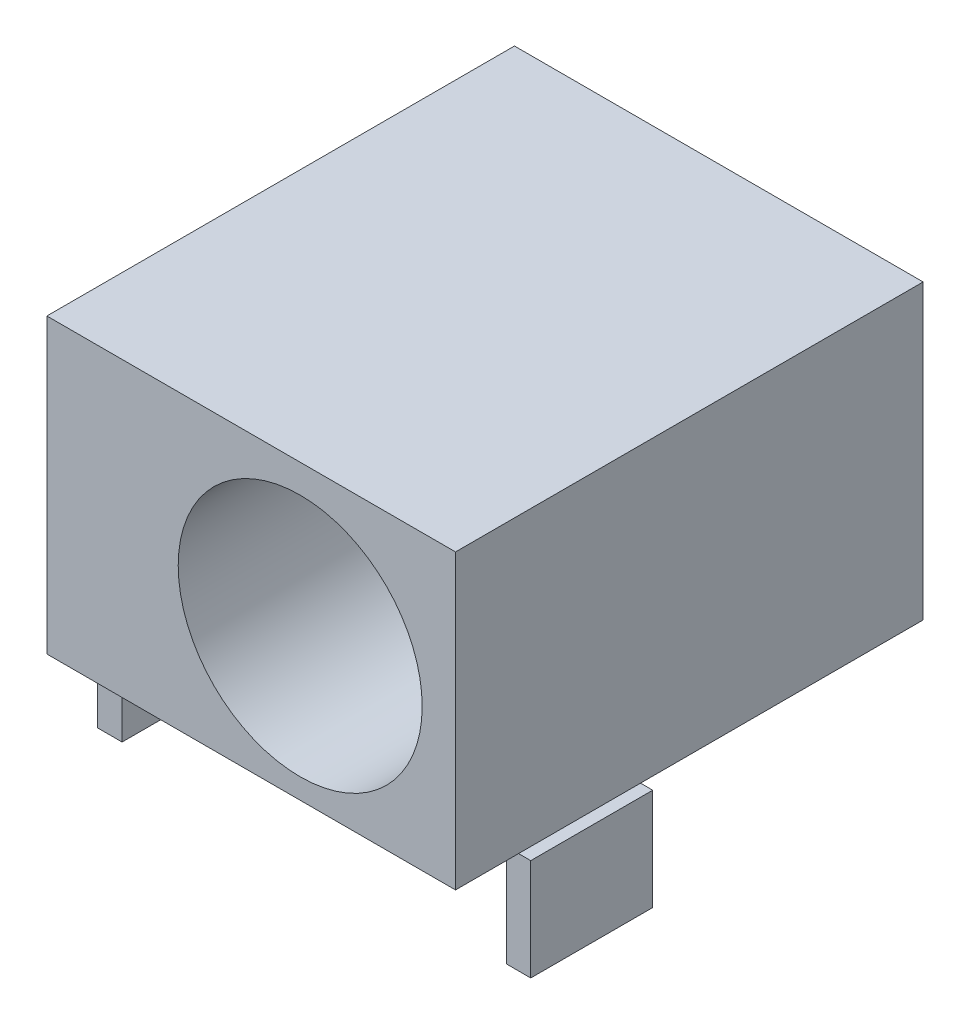
ISO-10303-21;
HEADER;
FILE_DESCRIPTION(('STEP AP214'),'2;1');
FILE_NAME('part.step','',(''),(''),'','','');
FILE_SCHEMA(('AUTOMOTIVE_DESIGN { 1 0 10303 214 1 1 1 1 }'));
ENDSEC;
DATA;
#1=APPLICATION_CONTEXT('core data for automotive mechanical design processes');
#2=APPLICATION_PROTOCOL_DEFINITION('international standard','automotive_design',2000,#1);
#3=PRODUCT_CONTEXT('',#1,'mechanical');
#4=PRODUCT('Part','Part','',(#3));
#5=PRODUCT_RELATED_PRODUCT_CATEGORY('part','',(#4));
#6=PRODUCT_DEFINITION_FORMATION('','',#4);
#7=PRODUCT_DEFINITION_CONTEXT('part definition',#1,'design');
#8=PRODUCT_DEFINITION('design','',#6,#7);
#9=PRODUCT_DEFINITION_SHAPE('','',#8);
#10=(LENGTH_UNIT() NAMED_UNIT(*) SI_UNIT(.MILLI.,.METRE.));
#11=(NAMED_UNIT(*) PLANE_ANGLE_UNIT() SI_UNIT($,.RADIAN.));
#12=(NAMED_UNIT(*) SI_UNIT($,.STERADIAN.) SOLID_ANGLE_UNIT());
#13=UNCERTAINTY_MEASURE_WITH_UNIT(LENGTH_MEASURE(1.E-05),#10,'distance_accuracy_value','');
#14=(GEOMETRIC_REPRESENTATION_CONTEXT(3) GLOBAL_UNCERTAINTY_ASSIGNED_CONTEXT((#13)) GLOBAL_UNIT_ASSIGNED_CONTEXT((#10,
#11,#12)) REPRESENTATION_CONTEXT('',''));
#15=CARTESIAN_POINT('',(0.,0.,0.));
#16=DIRECTION('',(0.,0.,1.));
#17=DIRECTION('',(1.,0.,0.));
#18=AXIS2_PLACEMENT_3D('',#15,#16,#17);
#19=CARTESIAN_POINT('',(0.,0.,0.));
#20=DIRECTION('',(0.,1.,0.));
#21=DIRECTION('',(0.,0.,1.));
#22=AXIS2_PLACEMENT_3D('',#19,#20,#21);
#23=PLANE('',#22);
#24=DIRECTION('',(1.,0.,0.));
#25=VECTOR('',#24,1.);
#26=CARTESIAN_POINT('',(0.,0.,1.2));
#27=LINE('',#26,#25);
#28=CARTESIAN_POINT('',(4.725,0.,1.2));
#29=VERTEX_POINT('',#28);
#30=CARTESIAN_POINT('',(5.025,0.,1.2));
#31=VERTEX_POINT('',#30);
#32=EDGE_CURVE('E161',#29,#31,#27,.T.);
#33=ORIENTED_EDGE('',*,*,#32,.F.);
#34=DIRECTION('',(0.,0.,1.));
#35=VECTOR('',#34,1.);
#36=CARTESIAN_POINT('',(4.725,0.,0.));
#37=LINE('',#36,#35);
#38=CARTESIAN_POINT('',(4.725,0.,4.2));
#39=VERTEX_POINT('',#38);
#40=EDGE_CURVE('E172',#29,#39,#37,.T.);
#41=ORIENTED_EDGE('',*,*,#40,.T.);
#42=DIRECTION('',(1.,0.,0.));
#43=VECTOR('',#42,1.);
#44=CARTESIAN_POINT('',(0.,0.,4.19999999999999));
#45=LINE('',#44,#43);
#46=CARTESIAN_POINT('',(5.025,0.,4.2));
#47=VERTEX_POINT('',#46);
#48=EDGE_CURVE('E142',#39,#47,#45,.T.);
#49=ORIENTED_EDGE('',*,*,#48,.T.);
#50=DIRECTION('',(0.,0.,1.));
#51=VECTOR('',#50,1.);
#52=CARTESIAN_POINT('',(5.025,0.,0.));
#53=LINE('',#52,#51);
#54=CARTESIAN_POINT('',(5.025,0.,5.75));
#55=VERTEX_POINT('',#54);
#56=EDGE_CURVE('E202',#47,#55,#53,.T.);
#57=ORIENTED_EDGE('',*,*,#56,.T.);
#58=DIRECTION('',(1.,0.,0.));
#59=VECTOR('',#58,1.);
#60=CARTESIAN_POINT('',(0.,0.,5.75));
#61=LINE('',#60,#59);
#62=CARTESIAN_POINT('',(-5.025,0.,5.75));
#63=VERTEX_POINT('',#62);
#64=EDGE_CURVE('E199',#63,#55,#61,.T.);
#65=ORIENTED_EDGE('',*,*,#64,.F.);
#66=DIRECTION('',(0.,0.,1.));
#67=VECTOR('',#66,1.);
#68=CARTESIAN_POINT('',(-5.025,0.,0.));
#69=LINE('',#68,#67);
#70=CARTESIAN_POINT('',(-5.025,0.,4.2));
#71=VERTEX_POINT('',#70);
#72=EDGE_CURVE('E46',#71,#63,#69,.T.);
#73=ORIENTED_EDGE('',*,*,#72,.F.);
#74=DIRECTION('',(-1.,0.,0.));
#75=VECTOR('',#74,1.);
#76=CARTESIAN_POINT('',(0.,0.,4.19999999999999));
#77=LINE('',#76,#75);
#78=CARTESIAN_POINT('',(-4.725,0.,4.2));
#79=VERTEX_POINT('',#78);
#80=EDGE_CURVE('E227',#79,#71,#77,.T.);
#81=ORIENTED_EDGE('',*,*,#80,.F.);
#82=DIRECTION('',(0.,0.,1.));
#83=VECTOR('',#82,1.);
#84=CARTESIAN_POINT('',(-4.725,0.,0.));
#85=LINE('',#84,#83);
#86=CARTESIAN_POINT('',(-4.725,0.,1.2));
#87=VERTEX_POINT('',#86);
#88=EDGE_CURVE('E229',#87,#79,#85,.T.);
#89=ORIENTED_EDGE('',*,*,#88,.F.);
#90=DIRECTION('',(-1.,0.,0.));
#91=VECTOR('',#90,1.);
#92=CARTESIAN_POINT('',(0.,0.,1.2));
#93=LINE('',#92,#91);
#94=CARTESIAN_POINT('',(-5.025,0.,1.2));
#95=VERTEX_POINT('',#94);
#96=EDGE_CURVE('E232',#87,#95,#93,.T.);
#97=ORIENTED_EDGE('',*,*,#96,.T.);
#98=CARTESIAN_POINT('',(-5.025,0.,-5.75));
#99=VERTEX_POINT('',#98);
#100=EDGE_CURVE('E45',#99,#95,#69,.T.);
#101=ORIENTED_EDGE('',*,*,#100,.F.);
#102=DIRECTION('',(1.,0.,0.));
#103=VECTOR('',#102,1.);
#104=CARTESIAN_POINT('',(0.,0.,-5.75));
#105=LINE('',#104,#103);
#106=CARTESIAN_POINT('',(5.025,0.,-5.75));
#107=VERTEX_POINT('',#106);
#108=EDGE_CURVE('E179',#99,#107,#105,.T.);
#109=ORIENTED_EDGE('',*,*,#108,.T.);
#110=EDGE_CURVE('E188',#107,#31,#53,.T.);
#111=ORIENTED_EDGE('',*,*,#110,.T.);
#112=EDGE_LOOP('',(#33,#41,#49,#57,#65,#73,#81,#89,#97,#101,#109,#111));
#113=FACE_BOUND('',#112,.T.);
#114=ADVANCED_FACE('F34',(#113),#23,.F.);
#115=CARTESIAN_POINT('',(0.,-2.5,4.19999999999999));
#116=DIRECTION('',(0.,0.,-1.));
#117=DIRECTION('',(-1.,0.,0.));
#118=AXIS2_PLACEMENT_3D('',#115,#116,#117);
#119=PLANE('',#118);
#120=ORIENTED_EDGE('',*,*,#80,.T.);
#121=CARTESIAN_POINT('',(-5.325,0.,4.2));
#122=VERTEX_POINT('',#121);
#123=EDGE_CURVE('E215',#71,#122,#77,.T.);
#124=ORIENTED_EDGE('',*,*,#123,.T.);
#125=DIRECTION('',(0.,1.,0.));
#126=VECTOR('',#125,1.);
#127=CARTESIAN_POINT('',(-5.325,-2.5,4.2));
#128=LINE('',#127,#126);
#129=CARTESIAN_POINT('',(-5.325,-2.5,4.2));
#130=VERTEX_POINT('',#129);
#131=EDGE_CURVE('E43',#130,#122,#128,.T.);
#132=ORIENTED_EDGE('',*,*,#131,.F.);
#133=DIRECTION('',(-1.,0.,0.));
#134=VECTOR('',#133,1.);
#135=CARTESIAN_POINT('',(0.,-2.5,4.19999999999999));
#136=LINE('',#135,#134);
#137=CARTESIAN_POINT('',(-4.725,-2.5,4.2));
#138=VERTEX_POINT('',#137);
#139=EDGE_CURVE('E216',#138,#130,#136,.T.);
#140=ORIENTED_EDGE('',*,*,#139,.F.);
#141=DIRECTION('',(0.,1.,0.));
#142=VECTOR('',#141,1.);
#143=CARTESIAN_POINT('',(-4.725,-2.5,4.2));
#144=LINE('',#143,#142);
#145=EDGE_CURVE('E38',#138,#79,#144,.T.);
#146=ORIENTED_EDGE('',*,*,#145,.T.);
#147=EDGE_LOOP('',(#120,#124,#132,#140,#146));
#148=FACE_BOUND('',#147,.T.);
#149=ADVANCED_FACE('F36',(#148),#119,.F.);
#150=CARTESIAN_POINT('',(-5.325,-2.5,0.));
#151=DIRECTION('',(-1.,0.,0.));
#152=DIRECTION('',(0.,0.,1.));
#153=AXIS2_PLACEMENT_3D('',#150,#151,#152);
#154=PLANE('',#153);
#155=DIRECTION('',(0.,0.,1.));
#156=VECTOR('',#155,1.);
#157=CARTESIAN_POINT('',(-5.325,0.,0.));
#158=LINE('',#157,#156);
#159=CARTESIAN_POINT('',(-5.325,0.,1.2));
#160=VERTEX_POINT('',#159);
#161=EDGE_CURVE('E219',#160,#122,#158,.T.);
#162=ORIENTED_EDGE('',*,*,#161,.F.);
#163=DIRECTION('',(0.,1.,0.));
#164=VECTOR('',#163,1.);
#165=CARTESIAN_POINT('',(-5.325,-2.5,1.2));
#166=LINE('',#165,#164);
#167=CARTESIAN_POINT('',(-5.325,-2.5,1.2));
#168=VERTEX_POINT('',#167);
#169=EDGE_CURVE('E239',#168,#160,#166,.T.);
#170=ORIENTED_EDGE('',*,*,#169,.F.);
#171=DIRECTION('',(0.,0.,1.));
#172=VECTOR('',#171,1.);
#173=CARTESIAN_POINT('',(-5.325,-2.5,0.));
#174=LINE('',#173,#172);
#175=EDGE_CURVE('E224',#168,#130,#174,.T.);
#176=ORIENTED_EDGE('',*,*,#175,.T.);
#177=ORIENTED_EDGE('',*,*,#131,.T.);
#178=EDGE_LOOP('',(#162,#170,#176,#177));
#179=FACE_BOUND('',#178,.T.);
#180=ADVANCED_FACE('F298',(#179),#154,.T.);
#181=CARTESIAN_POINT('',(0.,-2.5,1.2));
#182=DIRECTION('',(0.,0.,-1.));
#183=DIRECTION('',(-1.,0.,0.));
#184=AXIS2_PLACEMENT_3D('',#181,#182,#183);
#185=PLANE('',#184);
#186=ORIENTED_EDGE('',*,*,#96,.F.);
#187=DIRECTION('',(0.,1.,0.));
#188=VECTOR('',#187,1.);
#189=CARTESIAN_POINT('',(-4.725,-2.5,1.2));
#190=LINE('',#189,#188);
#191=CARTESIAN_POINT('',(-4.725,-2.5,1.2));
#192=VERTEX_POINT('',#191);
#193=EDGE_CURVE('E241',#192,#87,#190,.T.);
#194=ORIENTED_EDGE('',*,*,#193,.F.);
#195=DIRECTION('',(-1.,0.,0.));
#196=VECTOR('',#195,1.);
#197=CARTESIAN_POINT('',(0.,-2.5,1.2));
#198=LINE('',#197,#196);
#199=EDGE_CURVE('E221',#192,#168,#198,.T.);
#200=ORIENTED_EDGE('',*,*,#199,.T.);
#201=ORIENTED_EDGE('',*,*,#169,.T.);
#202=EDGE_CURVE('E231',#95,#160,#93,.T.);
#203=ORIENTED_EDGE('',*,*,#202,.F.);
#204=EDGE_LOOP('',(#186,#194,#200,#201,#203));
#205=FACE_BOUND('',#204,.T.);
#206=ADVANCED_FACE('F317',(#205),#185,.T.);
#207=CARTESIAN_POINT('',(-4.725,-2.5,0.));
#208=DIRECTION('',(-1.,0.,0.));
#209=DIRECTION('',(0.,0.,1.));
#210=AXIS2_PLACEMENT_3D('',#207,#208,#209);
#211=PLANE('',#210);
#212=ORIENTED_EDGE('',*,*,#88,.T.);
#213=ORIENTED_EDGE('',*,*,#145,.F.);
#214=DIRECTION('',(0.,0.,1.));
#215=VECTOR('',#214,1.);
#216=CARTESIAN_POINT('',(-4.725,-2.5,0.));
#217=LINE('',#216,#215);
#218=EDGE_CURVE('E218',#192,#138,#217,.T.);
#219=ORIENTED_EDGE('',*,*,#218,.F.);
#220=ORIENTED_EDGE('',*,*,#193,.T.);
#221=EDGE_LOOP('',(#212,#213,#219,#220));
#222=FACE_BOUND('',#221,.T.);
#223=ADVANCED_FACE('F311',(#222),#211,.F.);
#224=CARTESIAN_POINT('',(0.,-2.5,0.));
#225=DIRECTION('',(0.,1.,0.));
#226=DIRECTION('',(0.,0.,1.));
#227=AXIS2_PLACEMENT_3D('',#224,#225,#226);
#228=PLANE('',#227);
#229=ORIENTED_EDGE('',*,*,#139,.T.);
#230=ORIENTED_EDGE('',*,*,#175,.F.);
#231=ORIENTED_EDGE('',*,*,#199,.F.);
#232=ORIENTED_EDGE('',*,*,#218,.T.);
#233=EDGE_LOOP('',(#229,#230,#231,#232));
#234=FACE_BOUND('',#233,.T.);
#235=ADVANCED_FACE('F308',(#234),#228,.F.);
#236=CARTESIAN_POINT('',(0.,0.,0.));
#237=DIRECTION('',(0.,1.,0.));
#238=DIRECTION('',(0.,0.,1.));
#239=AXIS2_PLACEMENT_3D('',#236,#237,#238);
#240=PLANE('',#239);
#241=EDGE_CURVE('E12',#95,#71,#69,.T.);
#242=ORIENTED_EDGE('',*,*,#241,.F.);
#243=ORIENTED_EDGE('',*,*,#202,.T.);
#244=ORIENTED_EDGE('',*,*,#161,.T.);
#245=ORIENTED_EDGE('',*,*,#123,.F.);
#246=EDGE_LOOP('',(#242,#243,#244,#245));
#247=FACE_BOUND('',#246,.T.);
#248=ADVANCED_FACE('F307',(#247),#240,.T.);
#249=CARTESIAN_POINT('',(0.,7.2,-5.75));
#250=DIRECTION('',(0.,0.,-1.));
#251=DIRECTION('',(-1.,0.,0.));
#252=AXIS2_PLACEMENT_3D('',#249,#250,#251);
#253=PLANE('',#252);
#254=ORIENTED_EDGE('',*,*,#108,.F.);
#255=DIRECTION('',(0.,-1.,0.));
#256=VECTOR('',#255,1.);
#257=CARTESIAN_POINT('',(-5.025,7.2,-5.75));
#258=LINE('',#257,#256);
#259=CARTESIAN_POINT('',(-5.025,7.2,-5.75));
#260=VERTEX_POINT('',#259);
#261=EDGE_CURVE('E213',#260,#99,#258,.T.);
#262=ORIENTED_EDGE('',*,*,#261,.F.);
#263=DIRECTION('',(1.,0.,0.));
#264=VECTOR('',#263,1.);
#265=CARTESIAN_POINT('',(0.,7.2,-5.75));
#266=LINE('',#265,#264);
#267=CARTESIAN_POINT('',(5.025,7.2,-5.75));
#268=VERTEX_POINT('',#267);
#269=EDGE_CURVE('E184',#260,#268,#266,.T.);
#270=ORIENTED_EDGE('',*,*,#269,.T.);
#271=DIRECTION('',(0.,-1.,0.));
#272=VECTOR('',#271,1.);
#273=CARTESIAN_POINT('',(5.025,7.2,-5.75));
#274=LINE('',#273,#272);
#275=EDGE_CURVE('E195',#268,#107,#274,.T.);
#276=ORIENTED_EDGE('',*,*,#275,.T.);
#277=EDGE_LOOP('',(#254,#262,#270,#276));
#278=FACE_BOUND('',#277,.T.);
#279=ADVANCED_FACE('F264',(#278),#253,.T.);
#280=CARTESIAN_POINT('',(-5.025,7.2,0.));
#281=DIRECTION('',(1.,0.,0.));
#282=DIRECTION('',(0.,0.,-1.));
#283=AXIS2_PLACEMENT_3D('',#280,#281,#282);
#284=PLANE('',#283);
#285=ORIENTED_EDGE('',*,*,#100,.T.);
#286=ORIENTED_EDGE('',*,*,#241,.T.);
#287=ORIENTED_EDGE('',*,*,#72,.T.);
#288=DIRECTION('',(0.,-1.,0.));
#289=VECTOR('',#288,1.);
#290=CARTESIAN_POINT('',(-5.025,7.2,5.75));
#291=LINE('',#290,#289);
#292=CARTESIAN_POINT('',(-5.025,7.2,5.75));
#293=VERTEX_POINT('',#292);
#294=EDGE_CURVE('E210',#293,#63,#291,.T.);
#295=ORIENTED_EDGE('',*,*,#294,.F.);
#296=DIRECTION('',(0.,0.,1.));
#297=VECTOR('',#296,1.);
#298=CARTESIAN_POINT('',(-5.025,7.2,0.));
#299=LINE('',#298,#297);
#300=EDGE_CURVE('E187',#260,#293,#299,.T.);
#301=ORIENTED_EDGE('',*,*,#300,.F.);
#302=ORIENTED_EDGE('',*,*,#261,.T.);
#303=EDGE_LOOP('',(#285,#286,#287,#295,#301,#302));
#304=FACE_BOUND('',#303,.T.);
#305=ADVANCED_FACE('F258',(#304),#284,.F.);
#306=CARTESIAN_POINT('',(0.,7.2,5.75));
#307=DIRECTION('',(0.,0.,-1.));
#308=DIRECTION('',(-1.,0.,0.));
#309=AXIS2_PLACEMENT_3D('',#306,#307,#308);
#310=PLANE('',#309);
#311=CARTESIAN_POINT('',(1.205,3.5,5.75));
#312=DIRECTION('',(0.,0.,1.));
#313=DIRECTION('',(1.,0.,0.));
#314=AXIS2_PLACEMENT_3D('',#311,#312,#313);
#315=CIRCLE('',#314,3.);
#316=CARTESIAN_POINT('',(4.205,3.5,5.75));
#317=VERTEX_POINT('',#316);
#318=EDGE_CURVE('E432',#317,#317,#315,.T.);
#319=ORIENTED_EDGE('',*,*,#318,.F.);
#320=EDGE_LOOP('',(#319));
#321=FACE_BOUND('',#320,.T.);
#322=ORIENTED_EDGE('',*,*,#64,.T.);
#323=DIRECTION('',(0.,-1.,0.));
#324=VECTOR('',#323,1.);
#325=CARTESIAN_POINT('',(5.025,7.2,5.75));
#326=LINE('',#325,#324);
#327=CARTESIAN_POINT('',(5.025,7.2,5.75));
#328=VERTEX_POINT('',#327);
#329=EDGE_CURVE('E207',#328,#55,#326,.T.);
#330=ORIENTED_EDGE('',*,*,#329,.F.);
#331=DIRECTION('',(1.,0.,0.));
#332=VECTOR('',#331,1.);
#333=CARTESIAN_POINT('',(0.,7.2,5.75));
#334=LINE('',#333,#332);
#335=EDGE_CURVE('E190',#293,#328,#334,.T.);
#336=ORIENTED_EDGE('',*,*,#335,.F.);
#337=ORIENTED_EDGE('',*,*,#294,.T.);
#338=EDGE_LOOP('',(#322,#330,#336,#337));
#339=FACE_BOUND('',#338,.T.);
#340=ADVANCED_FACE('F282',(#321,#339),#310,.F.);
#341=CARTESIAN_POINT('',(5.025,7.2,0.));
#342=DIRECTION('',(1.,0.,0.));
#343=DIRECTION('',(0.,0.,-1.));
#344=AXIS2_PLACEMENT_3D('',#341,#342,#343);
#345=PLANE('',#344);
#346=ORIENTED_EDGE('',*,*,#110,.F.);
#347=ORIENTED_EDGE('',*,*,#275,.F.);
#348=DIRECTION('',(0.,0.,1.));
#349=VECTOR('',#348,1.);
#350=CARTESIAN_POINT('',(5.025,7.2,0.));
#351=LINE('',#350,#349);
#352=EDGE_CURVE('E192',#268,#328,#351,.T.);
#353=ORIENTED_EDGE('',*,*,#352,.T.);
#354=ORIENTED_EDGE('',*,*,#329,.T.);
#355=ORIENTED_EDGE('',*,*,#56,.F.);
#356=EDGE_CURVE('E205',#31,#47,#53,.T.);
#357=ORIENTED_EDGE('',*,*,#356,.F.);
#358=EDGE_LOOP('',(#346,#347,#353,#354,#355,#357));
#359=FACE_BOUND('',#358,.T.);
#360=ADVANCED_FACE('F268',(#359),#345,.T.);
#361=CARTESIAN_POINT('',(0.,7.2,0.));
#362=DIRECTION('',(0.,1.,0.));
#363=DIRECTION('',(0.,0.,1.));
#364=AXIS2_PLACEMENT_3D('',#361,#362,#363);
#365=PLANE('',#364);
#366=ORIENTED_EDGE('',*,*,#269,.F.);
#367=ORIENTED_EDGE('',*,*,#300,.T.);
#368=ORIENTED_EDGE('',*,*,#335,.T.);
#369=ORIENTED_EDGE('',*,*,#352,.F.);
#370=EDGE_LOOP('',(#366,#367,#368,#369));
#371=FACE_BOUND('',#370,.T.);
#372=ADVANCED_FACE('F284',(#371),#365,.T.);
#373=CARTESIAN_POINT('',(4.725,-2.5,0.));
#374=DIRECTION('',(-1.,0.,0.));
#375=DIRECTION('',(0.,0.,1.));
#376=AXIS2_PLACEMENT_3D('',#373,#374,#375);
#377=PLANE('',#376);
#378=ORIENTED_EDGE('',*,*,#40,.F.);
#379=DIRECTION('',(0.,1.,0.));
#380=VECTOR('',#379,1.);
#381=CARTESIAN_POINT('',(4.725,-2.5,1.2));
#382=LINE('',#381,#380);
#383=CARTESIAN_POINT('',(4.725,-2.5,1.2));
#384=VERTEX_POINT('',#383);
#385=EDGE_CURVE('E159',#384,#29,#382,.T.);
#386=ORIENTED_EDGE('',*,*,#385,.F.);
#387=DIRECTION('',(0.,0.,1.));
#388=VECTOR('',#387,1.);
#389=CARTESIAN_POINT('',(4.725,-2.5,0.));
#390=LINE('',#389,#388);
#391=CARTESIAN_POINT('',(4.725,-2.5,4.2));
#392=VERTEX_POINT('',#391);
#393=EDGE_CURVE('E153',#384,#392,#390,.T.);
#394=ORIENTED_EDGE('',*,*,#393,.T.);
#395=DIRECTION('',(0.,1.,0.));
#396=VECTOR('',#395,1.);
#397=CARTESIAN_POINT('',(4.725,-2.5,4.2));
#398=LINE('',#397,#396);
#399=EDGE_CURVE('E137',#392,#39,#398,.T.);
#400=ORIENTED_EDGE('',*,*,#399,.T.);
#401=EDGE_LOOP('',(#378,#386,#394,#400));
#402=FACE_BOUND('',#401,.T.);
#403=ADVANCED_FACE('F158',(#402),#377,.T.);
#404=CARTESIAN_POINT('',(0.,-2.5,1.2));
#405=DIRECTION('',(0.,0.,1.));
#406=DIRECTION('',(1.,0.,0.));
#407=AXIS2_PLACEMENT_3D('',#404,#405,#406);
#408=PLANE('',#407);
#409=ORIENTED_EDGE('',*,*,#32,.T.);
#410=CARTESIAN_POINT('',(5.325,0.,1.2));
#411=VERTEX_POINT('',#410);
#412=EDGE_CURVE('E164',#31,#411,#27,.T.);
#413=ORIENTED_EDGE('',*,*,#412,.T.);
#414=DIRECTION('',(0.,1.,0.));
#415=VECTOR('',#414,1.);
#416=CARTESIAN_POINT('',(5.325,-2.5,1.2));
#417=LINE('',#416,#415);
#418=CARTESIAN_POINT('',(5.325,-2.5,1.2));
#419=VERTEX_POINT('',#418);
#420=EDGE_CURVE('E180',#419,#411,#417,.T.);
#421=ORIENTED_EDGE('',*,*,#420,.F.);
#422=DIRECTION('',(1.,0.,0.));
#423=VECTOR('',#422,1.);
#424=CARTESIAN_POINT('',(0.,-2.5,1.2));
#425=LINE('',#424,#423);
#426=EDGE_CURVE('E148',#384,#419,#425,.T.);
#427=ORIENTED_EDGE('',*,*,#426,.F.);
#428=ORIENTED_EDGE('',*,*,#385,.T.);
#429=EDGE_LOOP('',(#409,#413,#421,#427,#428));
#430=FACE_BOUND('',#429,.T.);
#431=ADVANCED_FACE('F272',(#430),#408,.F.);
#432=CARTESIAN_POINT('',(5.325,-2.5,0.));
#433=DIRECTION('',(-1.,0.,0.));
#434=DIRECTION('',(0.,0.,1.));
#435=AXIS2_PLACEMENT_3D('',#432,#433,#434);
#436=PLANE('',#435);
#437=DIRECTION('',(0.,0.,1.));
#438=VECTOR('',#437,1.);
#439=CARTESIAN_POINT('',(5.325,0.,0.));
#440=LINE('',#439,#438);
#441=CARTESIAN_POINT('',(5.325,0.,4.2));
#442=VERTEX_POINT('',#441);
#443=EDGE_CURVE('E175',#411,#442,#440,.T.);
#444=ORIENTED_EDGE('',*,*,#443,.T.);
#445=DIRECTION('',(0.,1.,0.));
#446=VECTOR('',#445,1.);
#447=CARTESIAN_POINT('',(5.325,-2.5,4.2));
#448=LINE('',#447,#446);
#449=CARTESIAN_POINT('',(5.325,-2.5,4.2));
#450=VERTEX_POINT('',#449);
#451=EDGE_CURVE('E147',#450,#442,#448,.T.);
#452=ORIENTED_EDGE('',*,*,#451,.F.);
#453=DIRECTION('',(0.,0.,1.));
#454=VECTOR('',#453,1.);
#455=CARTESIAN_POINT('',(5.325,-2.5,0.));
#456=LINE('',#455,#454);
#457=EDGE_CURVE('E155',#419,#450,#456,.T.);
#458=ORIENTED_EDGE('',*,*,#457,.F.);
#459=ORIENTED_EDGE('',*,*,#420,.T.);
#460=EDGE_LOOP('',(#444,#452,#458,#459));
#461=FACE_BOUND('',#460,.T.);
#462=ADVANCED_FACE('F276',(#461),#436,.F.);
#463=CARTESIAN_POINT('',(0.,-2.5,4.19999999999999));
#464=DIRECTION('',(0.,0.,1.));
#465=DIRECTION('',(1.,0.,0.));
#466=AXIS2_PLACEMENT_3D('',#463,#464,#465);
#467=PLANE('',#466);
#468=ORIENTED_EDGE('',*,*,#48,.F.);
#469=ORIENTED_EDGE('',*,*,#399,.F.);
#470=DIRECTION('',(1.,0.,0.));
#471=VECTOR('',#470,1.);
#472=CARTESIAN_POINT('',(0.,-2.5,4.19999999999999));
#473=LINE('',#472,#471);
#474=EDGE_CURVE('E140',#392,#450,#473,.T.);
#475=ORIENTED_EDGE('',*,*,#474,.T.);
#476=ORIENTED_EDGE('',*,*,#451,.T.);
#477=EDGE_CURVE('E53',#47,#442,#45,.T.);
#478=ORIENTED_EDGE('',*,*,#477,.F.);
#479=EDGE_LOOP('',(#468,#469,#475,#476,#478));
#480=FACE_BOUND('',#479,.T.);
#481=ADVANCED_FACE('F139',(#480),#467,.T.);
#482=CARTESIAN_POINT('',(0.,-2.5,0.));
#483=DIRECTION('',(0.,1.,0.));
#484=DIRECTION('',(0.,0.,1.));
#485=AXIS2_PLACEMENT_3D('',#482,#483,#484);
#486=PLANE('',#485);
#487=ORIENTED_EDGE('',*,*,#393,.F.);
#488=ORIENTED_EDGE('',*,*,#426,.T.);
#489=ORIENTED_EDGE('',*,*,#457,.T.);
#490=ORIENTED_EDGE('',*,*,#474,.F.);
#491=EDGE_LOOP('',(#487,#488,#489,#490));
#492=FACE_BOUND('',#491,.T.);
#493=ADVANCED_FACE('F152',(#492),#486,.F.);
#494=CARTESIAN_POINT('',(0.,0.,0.));
#495=DIRECTION('',(0.,1.,0.));
#496=DIRECTION('',(0.,0.,1.));
#497=AXIS2_PLACEMENT_3D('',#494,#495,#496);
#498=PLANE('',#497);
#499=ORIENTED_EDGE('',*,*,#412,.F.);
#500=ORIENTED_EDGE('',*,*,#356,.T.);
#501=ORIENTED_EDGE('',*,*,#477,.T.);
#502=ORIENTED_EDGE('',*,*,#443,.F.);
#503=EDGE_LOOP('',(#499,#500,#501,#502));
#504=FACE_BOUND('',#503,.T.);
#505=ADVANCED_FACE('F278',(#504),#498,.T.);
#506=CARTESIAN_POINT('',(0.,0.,-2.45));
#507=DIRECTION('',(0.,0.,-1.));
#508=DIRECTION('',(-1.,0.,0.));
#509=AXIS2_PLACEMENT_3D('',#506,#507,#508);
#510=PLANE('',#509);
#511=CARTESIAN_POINT('',(1.205,3.5,-2.45));
#512=DIRECTION('',(0.,0.,1.));
#513=DIRECTION('',(1.,0.,0.));
#514=AXIS2_PLACEMENT_3D('',#511,#512,#513);
#515=CIRCLE('',#514,3.);
#516=CARTESIAN_POINT('',(4.205,3.5,-2.45));
#517=VERTEX_POINT('',#516);
#518=EDGE_CURVE('E167',#517,#517,#515,.T.);
#519=ORIENTED_EDGE('',*,*,#518,.T.);
#520=EDGE_LOOP('',(#519));
#521=FACE_BOUND('',#520,.T.);
#522=ADVANCED_FACE('F406',(#521),#510,.F.);
#523=CARTESIAN_POINT('',(1.205,3.5,5.75));
#524=DIRECTION('',(0.,0.,-1.));
#525=DIRECTION('',(-1.,0.,0.));
#526=AXIS2_PLACEMENT_3D('',#523,#524,#525);
#527=CYLINDRICAL_SURFACE('',#526,3.);
#528=ORIENTED_EDGE('',*,*,#318,.T.);
#529=EDGE_LOOP('',(#528));
#530=FACE_BOUND('',#529,.T.);
#531=ORIENTED_EDGE('',*,*,#518,.F.);
#532=EDGE_LOOP('',(#531));
#533=FACE_BOUND('',#532,.T.);
#534=ADVANCED_FACE('F408',(#530,#533),#527,.F.);
#535=CLOSED_SHELL('',(#114,#149,#180,#206,#223,#235,#248,#279,#305,#340,#360,#372,#403,#431,
#462,#481,#493,#505,#522,#534));
#536=MANIFOLD_SOLID_BREP('B2',#535);
#537=ADVANCED_BREP_SHAPE_REPRESENTATION('',(#18,#536),#14);
#538=SHAPE_DEFINITION_REPRESENTATION(#9,#537);
ENDSEC;
END-ISO-10303-21;
